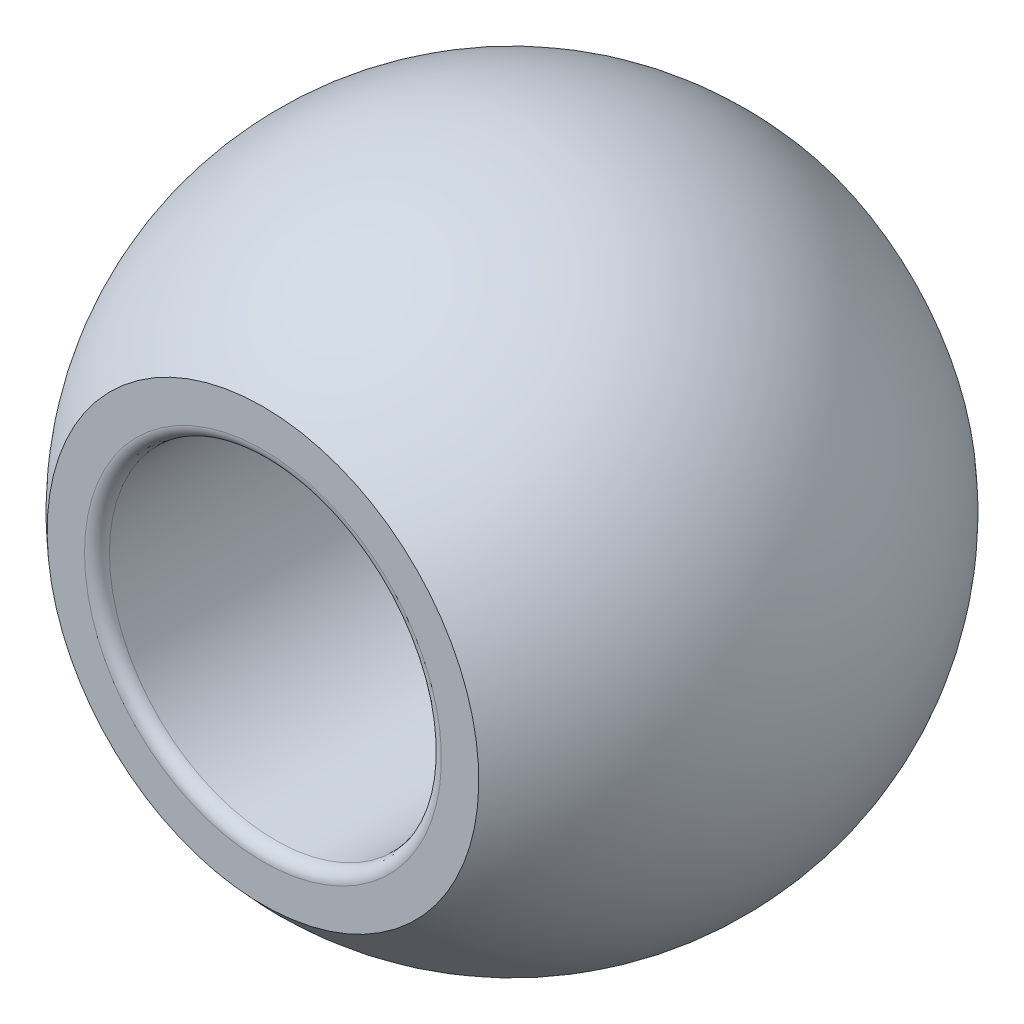
ISO-10303-21;
HEADER;
FILE_DESCRIPTION(('STEP AP214'),'2;1');
FILE_NAME('part.step','',(''),(''),'','','');
FILE_SCHEMA(('AUTOMOTIVE_DESIGN { 1 0 10303 214 1 1 1 1 }'));
ENDSEC;
DATA;
#1=APPLICATION_CONTEXT('core data for automotive mechanical design processes');
#2=APPLICATION_PROTOCOL_DEFINITION('international standard','automotive_design',2000,#1);
#3=PRODUCT_CONTEXT('',#1,'mechanical');
#4=PRODUCT('Part','Part','',(#3));
#5=PRODUCT_RELATED_PRODUCT_CATEGORY('part','',(#4));
#6=PRODUCT_DEFINITION_FORMATION('','',#4);
#7=PRODUCT_DEFINITION_CONTEXT('part definition',#1,'design');
#8=PRODUCT_DEFINITION('design','',#6,#7);
#9=PRODUCT_DEFINITION_SHAPE('','',#8);
#10=(LENGTH_UNIT() NAMED_UNIT(*) SI_UNIT(.MILLI.,.METRE.));
#11=(NAMED_UNIT(*) PLANE_ANGLE_UNIT() SI_UNIT($,.RADIAN.));
#12=(NAMED_UNIT(*) SI_UNIT($,.STERADIAN.) SOLID_ANGLE_UNIT());
#13=UNCERTAINTY_MEASURE_WITH_UNIT(LENGTH_MEASURE(1.E-05),#10,'distance_accuracy_value','');
#14=(GEOMETRIC_REPRESENTATION_CONTEXT(3) GLOBAL_UNCERTAINTY_ASSIGNED_CONTEXT((#13)) GLOBAL_UNIT_ASSIGNED_CONTEXT((#10,
#11,#12)) REPRESENTATION_CONTEXT('',''));
#15=CARTESIAN_POINT('',(0.,0.,0.));
#16=DIRECTION('',(0.,0.,1.));
#17=DIRECTION('',(1.,0.,0.));
#18=AXIS2_PLACEMENT_3D('',#15,#16,#17);
#19=CARTESIAN_POINT('',(0.,0.,0.));
#20=DIRECTION('',(0.,0.,-1.));
#21=DIRECTION('',(0.,1.,0.));
#22=AXIS2_PLACEMENT_3D('',#19,#20,#21);
#23=SPHERICAL_SURFACE('',#22,7.93977329651165);
#24=CARTESIAN_POINT('',(0.,0.,6.));
#25=DIRECTION('',(0.,0.,-1.));
#26=DIRECTION('',(-1.,0.,0.));
#27=AXIS2_PLACEMENT_3D('',#24,#25,#26);
#28=CIRCLE('',#27,5.19999999999995);
#29=CARTESIAN_POINT('',(0.,5.2,6.));
#30=VERTEX_POINT('',#29);
#31=EDGE_CURVE('E38',#30,#30,#28,.T.);
#32=CARTESIAN_POINT('',(0.,0.,-6.));
#33=DIRECTION('',(0.,0.,-1.));
#34=DIRECTION('',(-1.,0.,0.));
#35=AXIS2_PLACEMENT_3D('',#32,#33,#34);
#36=CIRCLE('',#35,5.19999999999995);
#37=CARTESIAN_POINT('',(0.,5.2,-6.));
#38=VERTEX_POINT('',#37);
#39=EDGE_CURVE('E35',#38,#38,#36,.T.);
#40=CARTESIAN_POINT('',(0.,5.2,6.));
#41=CARTESIAN_POINT('',(0.,5.30709091113798,5.90719303847969));
#42=CARTESIAN_POINT('',(0.,5.41169182233174,5.81151355295221));
#43=CARTESIAN_POINT('',(0.,5.61562573717542,5.61469611787849));
#44=CARTESIAN_POINT('',(0.,5.71495874082536,5.51355816833225));
#45=CARTESIAN_POINT('',(0.,5.90806893292606,5.3061103892165));
#46=CARTESIAN_POINT('',(0.,6.00184612137682,5.19980055964701));
#47=CARTESIAN_POINT('',(0.,6.18357674583192,4.98231462077139));
#48=CARTESIAN_POINT('',(0.,6.27153018183624,4.87113851146526));
#49=CARTESIAN_POINT('',(0.,6.44136097260786,4.64423843825446));
#50=CARTESIAN_POINT('',(0.,6.52323832737516,4.52851447434978));
#51=CARTESIAN_POINT('',(0.,6.68068233314752,4.29285045351839));
#52=CARTESIAN_POINT('',(0.,6.75624898415259,4.17291039659167));
#53=CARTESIAN_POINT('',(0.,6.90085497032309,3.92915795517168));
#54=CARTESIAN_POINT('',(0.,6.96989430548853,3.8053455706784));
#55=CARTESIAN_POINT('',(0.,7.10124777791145,3.5542033603887));
#56=CARTESIAN_POINT('',(0.,7.16356191516893,3.42687353459229));
#57=CARTESIAN_POINT('',(0.,7.2812863804596,3.16906140416193));
#58=CARTESIAN_POINT('',(0.,7.33669670849278,3.038579099528));
#59=CARTESIAN_POINT('',(0.,7.4404547338072,2.7748360113455));
#60=CARTESIAN_POINT('',(0.,7.48880243108842,2.64157522779695));
#61=CARTESIAN_POINT('',(0.,7.57829661648924,2.37265714520744));
#62=CARTESIAN_POINT('',(0.,7.61944310460882,2.23699984616649));
#63=CARTESIAN_POINT('',(0.,7.69441693410875,1.96367756522445));
#64=CARTESIAN_POINT('',(0.,7.72824427548909,1.82601258332336));
#65=CARTESIAN_POINT('',(0.,7.78848285267149,1.54906952385664));
#66=CARTESIAN_POINT('',(0.,7.81489408847355,1.409791446291));
#67=CARTESIAN_POINT('',(0.,7.86022475234723,1.13002140629215));
#68=CARTESIAN_POINT('',(0.,7.87914418041884,0.98952944385894));
#69=CARTESIAN_POINT('',(0.,7.90943700034052,0.707734324260938));
#70=CARTESIAN_POINT('',(0.,7.9208103921906,0.566431167096142));
#71=CARTESIAN_POINT('',(0.,7.93597854027618,0.283418673287565));
#72=CARTESIAN_POINT('',(0.,7.9397732965117,0.141709336643782));
#73=CARTESIAN_POINT('',(0.,7.9397732965117,-0.141709336643782));
#74=CARTESIAN_POINT('',(0.,7.93597854027618,-0.283418673287565));
#75=CARTESIAN_POINT('',(0.,7.9208103921906,-0.566431167096142));
#76=CARTESIAN_POINT('',(0.,7.90943700034052,-0.707734324260938));
#77=CARTESIAN_POINT('',(0.,7.87914418041884,-0.98952944385894));
#78=CARTESIAN_POINT('',(0.,7.86022475234723,-1.13002140629215));
#79=CARTESIAN_POINT('',(0.,7.81489408847355,-1.409791446291));
#80=CARTESIAN_POINT('',(0.,7.78848285267149,-1.54906952385664));
#81=CARTESIAN_POINT('',(0.,7.72824427548909,-1.82601258332336));
#82=CARTESIAN_POINT('',(0.,7.69441693410875,-1.96367756522445));
#83=CARTESIAN_POINT('',(0.,7.61944310460882,-2.23699984616649));
#84=CARTESIAN_POINT('',(0.,7.57829661648924,-2.37265714520744));
#85=CARTESIAN_POINT('',(0.,7.48880243108842,-2.64157522779695));
#86=CARTESIAN_POINT('',(0.,7.4404547338072,-2.77483601134551));
#87=CARTESIAN_POINT('',(0.,7.33669670849278,-3.038579099528));
#88=CARTESIAN_POINT('',(0.,7.2812863804596,-3.16906140416193));
#89=CARTESIAN_POINT('',(0.,7.16356191516893,-3.42687353459228));
#90=CARTESIAN_POINT('',(0.,7.10124777791145,-3.5542033603887));
#91=CARTESIAN_POINT('',(0.,6.96989430548853,-3.8053455706784));
#92=CARTESIAN_POINT('',(0.,6.90085497032309,-3.92915795517167));
#93=CARTESIAN_POINT('',(0.,6.75624898415259,-4.17291039659167));
#94=CARTESIAN_POINT('',(0.,6.68068233314752,-4.29285045351839));
#95=CARTESIAN_POINT('',(0.,6.52323832737516,-4.52851447434978));
#96=CARTESIAN_POINT('',(0.,6.44136097260786,-4.64423843825446));
#97=CARTESIAN_POINT('',(0.,6.27153018183624,-4.87113851146526));
#98=CARTESIAN_POINT('',(0.,6.18357674583192,-4.98231462077139));
#99=CARTESIAN_POINT('',(0.,6.00184612137682,-5.19980055964701));
#100=CARTESIAN_POINT('',(0.,5.90806893292606,-5.3061103892165));
#101=CARTESIAN_POINT('',(0.,5.71495874082536,-5.51355816833225));
#102=CARTESIAN_POINT('',(0.,5.61562573717542,-5.61469611787849));
#103=CARTESIAN_POINT('',(0.,5.41169182233174,-5.81151355295221));
#104=CARTESIAN_POINT('',(0.,5.30709091113798,-5.90719303847968));
#105=CARTESIAN_POINT('',(0.,5.2,-6.));
#106=B_SPLINE_CURVE_WITH_KNOTS('',3,(#40,#41,#42,#43,#44,#45,#46,#47,#48,#49,#50,#51,#52,#53,
#54,#55,#56,#57,#58,#59,#60,#61,#62,#63,#64,#65,#66,#67,#68,#69,#70,#71,#72,#73,#74,#75,#76,#77,
#78,#79,#80,#81,#82,#83,#84,#85,#86,#87,#88,#89,#90,#91,#92,#93,#94,#95,#96,#97,#98,#99,#100,
#101,#102,#103,#104,#105),.UNSPECIFIED.,.F.,.F.,(4,2,2,2,2,2,2,2,2,2,2,2,2,2,2,2,2,2,2,2,2,2,2,
2,2,2,2,2,2,2,2,2,4),(0.,0.425077246601786,0.850154493203572,1.27523173980536,1.70030898640714,
2.12538623300893,2.55046347961072,2.9755407262125,3.40061797281429,3.82569521941608,
4.25077246601786,4.67584971261965,5.10092695922143,5.52600420582322,5.95108145242501,
6.37615869902679,6.80123594562858,7.22631319223037,7.65139043883215,8.07646768543394,
8.50154493203573,8.92662217863751,9.3516994252393,9.77677667184109,10.2018539184429,
10.6269311650447,11.0520084116464,11.4770856582482,11.90216290485,12.3272401514518,
12.7523173980536,13.1773946446554,13.6024718912572),.UNSPECIFIED.);
#107=EDGE_CURVE('BSEAM15',#30,#38,#106,.T.);
#108=ORIENTED_EDGE('',*,*,#31,.T.);
#109=ORIENTED_EDGE('',*,*,#39,.F.);
#110=ORIENTED_EDGE('',*,*,#107,.T.);
#111=ORIENTED_EDGE('',*,*,#107,.F.);
#112=EDGE_LOOP('',(#108,#110,#109,#111));
#113=FACE_BOUND('',#112,.T.);
#114=ADVANCED_FACE('F15',(#113),#23,.T.);
#115=CARTESIAN_POINT('',(0.,5.2,6.));
#116=DIRECTION('',(0.,0.,1.));
#117=DIRECTION('',(1.,0.,0.));
#118=AXIS2_PLACEMENT_3D('',#115,#116,#117);
#119=PLANE('',#118);
#120=CARTESIAN_POINT('',(0.,0.,6.));
#121=DIRECTION('',(0.,0.,-1.));
#122=DIRECTION('',(-1.,0.,0.));
#123=AXIS2_PLACEMENT_3D('',#120,#121,#122);
#124=CIRCLE('',#123,4.29999999999988);
#125=CARTESIAN_POINT('',(-4.29999999999988,0.,6.));
#126=VERTEX_POINT('',#125);
#127=EDGE_CURVE('E30',#126,#126,#124,.T.);
#128=ORIENTED_EDGE('',*,*,#127,.T.);
#129=EDGE_LOOP('',(#128));
#130=FACE_BOUND('',#129,.T.);
#131=ORIENTED_EDGE('',*,*,#31,.F.);
#132=EDGE_LOOP('',(#131));
#133=FACE_BOUND('',#132,.T.);
#134=ADVANCED_FACE('F44',(#130,#133),#119,.T.);
#135=CARTESIAN_POINT('',(0.,0.,5.70000000000012));
#136=DIRECTION('',(0.,0.,-1.));
#137=DIRECTION('',(-1.,0.,0.));
#138=AXIS2_PLACEMENT_3D('',#135,#136,#137);
#139=TOROIDAL_SURFACE('',#138,4.29999999999988,0.299999999999876);
#140=CARTESIAN_POINT('',(0.,0.,5.7));
#141=DIRECTION('',(0.,0.,-1.));
#142=DIRECTION('',(-1.,0.,0.));
#143=AXIS2_PLACEMENT_3D('',#140,#141,#142);
#144=CIRCLE('',#143,4.);
#145=CARTESIAN_POINT('',(-4.,0.,5.7));
#146=VERTEX_POINT('',#145);
#147=EDGE_CURVE('E26',#146,#146,#144,.T.);
#148=ORIENTED_EDGE('',*,*,#147,.T.);
#149=EDGE_LOOP('',(#148));
#150=FACE_BOUND('',#149,.T.);
#151=ORIENTED_EDGE('',*,*,#127,.F.);
#152=EDGE_LOOP('',(#151));
#153=FACE_BOUND('',#152,.T.);
#154=ADVANCED_FACE('F46',(#150,#153),#139,.T.);
#155=CARTESIAN_POINT('',(0.,0.,-50.));
#156=DIRECTION('',(0.,0.,-1.));
#157=DIRECTION('',(-1.,0.,0.));
#158=AXIS2_PLACEMENT_3D('',#155,#156,#157);
#159=CYLINDRICAL_SURFACE('',#158,4.);
#160=CARTESIAN_POINT('',(0.,0.,-5.7));
#161=DIRECTION('',(0.,0.,-1.));
#162=DIRECTION('',(-1.,0.,0.));
#163=AXIS2_PLACEMENT_3D('',#160,#161,#162);
#164=CIRCLE('',#163,4.);
#165=CARTESIAN_POINT('',(-4.,0.,-5.7));
#166=VERTEX_POINT('',#165);
#167=EDGE_CURVE('E22',#166,#166,#164,.T.);
#168=ORIENTED_EDGE('',*,*,#167,.T.);
#169=EDGE_LOOP('',(#168));
#170=FACE_BOUND('',#169,.T.);
#171=ORIENTED_EDGE('',*,*,#147,.F.);
#172=EDGE_LOOP('',(#171));
#173=FACE_BOUND('',#172,.T.);
#174=ADVANCED_FACE('F54',(#170,#173),#159,.F.);
#175=CARTESIAN_POINT('',(0.,0.,-5.70000000000012));
#176=DIRECTION('',(0.,0.,-1.));
#177=DIRECTION('',(-1.,0.,0.));
#178=AXIS2_PLACEMENT_3D('',#175,#176,#177);
#179=TOROIDAL_SURFACE('',#178,4.29999999999988,0.299999999999876);
#180=CARTESIAN_POINT('',(0.,0.,-6.));
#181=DIRECTION('',(0.,0.,-1.));
#182=DIRECTION('',(-1.,0.,0.));
#183=AXIS2_PLACEMENT_3D('',#180,#181,#182);
#184=CIRCLE('',#183,4.29999999999988);
#185=CARTESIAN_POINT('',(-4.29999999999988,0.,-6.));
#186=VERTEX_POINT('',#185);
#187=EDGE_CURVE('E10',#186,#186,#184,.T.);
#188=ORIENTED_EDGE('',*,*,#187,.T.);
#189=EDGE_LOOP('',(#188));
#190=FACE_BOUND('',#189,.T.);
#191=ORIENTED_EDGE('',*,*,#167,.F.);
#192=EDGE_LOOP('',(#191));
#193=FACE_BOUND('',#192,.T.);
#194=ADVANCED_FACE('F60',(#190,#193),#179,.T.);
#195=CARTESIAN_POINT('',(0.,4.3,-6.));
#196=DIRECTION('',(0.,0.,-1.));
#197=DIRECTION('',(-1.,0.,0.));
#198=AXIS2_PLACEMENT_3D('',#195,#196,#197);
#199=PLANE('',#198);
#200=ORIENTED_EDGE('',*,*,#39,.T.);
#201=EDGE_LOOP('',(#200));
#202=FACE_BOUND('',#201,.T.);
#203=ORIENTED_EDGE('',*,*,#187,.F.);
#204=EDGE_LOOP('',(#203));
#205=FACE_BOUND('',#204,.T.);
#206=ADVANCED_FACE('F17',(#202,#205),#199,.T.);
#207=CLOSED_SHELL('',(#114,#134,#154,#174,#194,#206));
#208=MANIFOLD_SOLID_BREP('B1',#207);
#209=ADVANCED_BREP_SHAPE_REPRESENTATION('',(#18,#208),#14);
#210=SHAPE_DEFINITION_REPRESENTATION(#9,#209);
ENDSEC;
END-ISO-10303-21;
